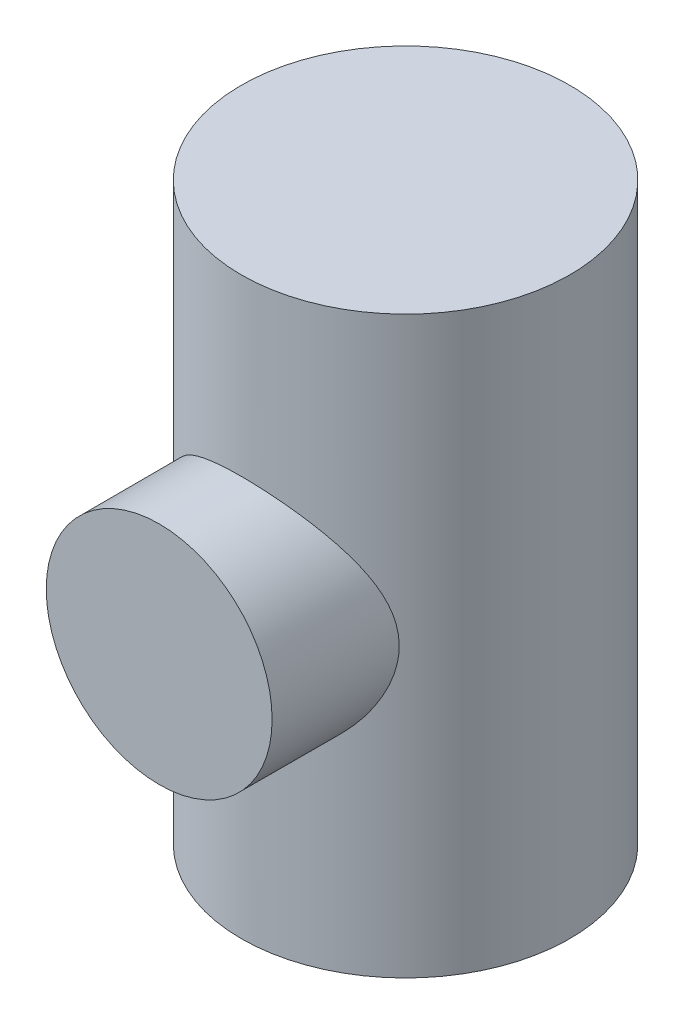
ISO-10303-21;
HEADER;
FILE_DESCRIPTION(('STEP AP214'),'2;1');
FILE_NAME('part.step','',(''),(''),'','','');
FILE_SCHEMA(('AUTOMOTIVE_DESIGN { 1 0 10303 214 1 1 1 1 }'));
ENDSEC;
DATA;
#1=APPLICATION_CONTEXT('core data for automotive mechanical design processes');
#2=APPLICATION_PROTOCOL_DEFINITION('international standard','automotive_design',2000,#1);
#3=PRODUCT_CONTEXT('',#1,'mechanical');
#4=PRODUCT('Part','Part','',(#3));
#5=PRODUCT_RELATED_PRODUCT_CATEGORY('part','',(#4));
#6=PRODUCT_DEFINITION_FORMATION('','',#4);
#7=PRODUCT_DEFINITION_CONTEXT('part definition',#1,'design');
#8=PRODUCT_DEFINITION('design','',#6,#7);
#9=PRODUCT_DEFINITION_SHAPE('','',#8);
#10=(LENGTH_UNIT() NAMED_UNIT(*) SI_UNIT(.MILLI.,.METRE.));
#11=(NAMED_UNIT(*) PLANE_ANGLE_UNIT() SI_UNIT($,.RADIAN.));
#12=(NAMED_UNIT(*) SI_UNIT($,.STERADIAN.) SOLID_ANGLE_UNIT());
#13=UNCERTAINTY_MEASURE_WITH_UNIT(LENGTH_MEASURE(1.E-05),#10,'distance_accuracy_value','');
#14=(GEOMETRIC_REPRESENTATION_CONTEXT(3) GLOBAL_UNCERTAINTY_ASSIGNED_CONTEXT((#13)) GLOBAL_UNIT_ASSIGNED_CONTEXT((#10,
#11,#12)) REPRESENTATION_CONTEXT('',''));
#15=CARTESIAN_POINT('',(0.,0.,0.));
#16=DIRECTION('',(0.,0.,1.));
#17=DIRECTION('',(1.,0.,0.));
#18=AXIS2_PLACEMENT_3D('',#15,#16,#17);
#19=CARTESIAN_POINT('',(0.,88.9,0.));
#20=DIRECTION('',(0.,-1.,0.));
#21=DIRECTION('',(0.,0.,-1.));
#22=AXIS2_PLACEMENT_3D('',#19,#20,#21);
#23=CYLINDRICAL_SURFACE('',#22,50.8);
#24=CARTESIAN_POINT('',(0.,88.9,0.));
#25=DIRECTION('',(0.,1.,0.));
#26=DIRECTION('',(0.,0.,1.));
#27=AXIS2_PLACEMENT_3D('',#24,#25,#26);
#28=CIRCLE('',#27,50.8);
#29=CARTESIAN_POINT('',(0.,88.9,50.8));
#30=VERTEX_POINT('',#29);
#31=EDGE_CURVE('E42',#30,#30,#28,.T.);
#32=ORIENTED_EDGE('',*,*,#31,.F.);
#33=EDGE_LOOP('',(#32));
#34=FACE_BOUND('',#33,.T.);
#35=CARTESIAN_POINT('',(0.,-88.9,0.));
#36=DIRECTION('',(0.,1.,0.));
#37=DIRECTION('',(0.,0.,1.));
#38=AXIS2_PLACEMENT_3D('',#35,#36,#37);
#39=CIRCLE('',#38,50.8);
#40=CARTESIAN_POINT('',(0.,-88.9,50.8));
#41=VERTEX_POINT('',#40);
#42=EDGE_CURVE('E46',#41,#41,#39,.T.);
#43=ORIENTED_EDGE('',*,*,#42,.T.);
#44=EDGE_LOOP('',(#43));
#45=FACE_BOUND('',#44,.T.);
#46=CARTESIAN_POINT('',(-34.925,0.,36.8901663726257));
#47=CARTESIAN_POINT('',(-34.9249914845288,-0.843645731352331,36.8901814735616));
#48=CARTESIAN_POINT('',(-34.8943613775967,-1.68741694630255,36.9192472565266));
#49=CARTESIAN_POINT('',(-34.7725461859095,-3.36673884233864,37.0339946630768));
#50=CARTESIAN_POINT('',(-34.6813479718474,-4.20228770120932,37.1196885618797));
#51=CARTESIAN_POINT('',(-34.4402049805243,-5.85919430438415,37.3435299889975));
#52=CARTESIAN_POINT('',(-34.2901538949403,-6.68052354412421,37.4817724238395));
#53=CARTESIAN_POINT('',(-33.9341723961664,-8.30159253245522,37.8043571230568));
#54=CARTESIAN_POINT('',(-33.7282411984882,-9.10133197777859,37.9887000346235));
#55=CARTESIAN_POINT('',(-33.2661981806663,-10.6665122789953,38.3939230305388));
#56=CARTESIAN_POINT('',(-33.0106542365401,-11.4322308708088,38.6143855983015));
#57=CARTESIAN_POINT('',(-32.450863810428,-12.9360303517467,39.0859982808274));
#58=CARTESIAN_POINT('',(-32.1466088030051,-13.6741063748994,39.3371537656572));
#59=CARTESIAN_POINT('',(-31.6557575718443,-14.7589371672977,39.7315632108823));
#60=CARTESIAN_POINT('',(-31.4863843597101,-15.1168546460022,39.8659877746421));
#61=CARTESIAN_POINT('',(-31.136447887631,-15.8250809971001,40.1398925175332));
#62=CARTESIAN_POINT('',(-30.9558875769675,-16.1753918422367,40.2793713602015));
#63=CARTESIAN_POINT('',(-30.3976983799822,-17.2149476316831,40.704281717814));
#64=CARTESIAN_POINT('',(-30.0035781882484,-17.8927784395359,40.9961733124769));
#65=CARTESIAN_POINT('',(-29.1036248806838,-19.3278911000392,41.6410208359239));
#66=CARTESIAN_POINT('',(-28.5901389257298,-20.0794524277431,41.9960128744349));
#67=CARTESIAN_POINT('',(-27.5078739995737,-21.538277518041,42.7127407810997));
#68=CARTESIAN_POINT('',(-26.9390909982723,-22.2455380457663,43.0744771392306));
#69=CARTESIAN_POINT('',(-25.7472923062065,-23.6147663047742,43.7972962674638));
#70=CARTESIAN_POINT('',(-25.1242173709284,-24.2766831134173,44.1583778733361));
#71=CARTESIAN_POINT('',(-23.8258762877271,-25.552132152644,44.8722254652959));
#72=CARTESIAN_POINT('',(-23.1506067212935,-26.1656612087247,45.2249909047345));
#73=CARTESIAN_POINT('',(-21.6383552410146,-27.4346400750145,45.9699874430229));
#74=CARTESIAN_POINT('',(-20.7926997439503,-28.0813399632176,46.3596205356045));
#75=CARTESIAN_POINT('',(-19.0363525940616,-29.3004436439954,47.1080561767333));
#76=CARTESIAN_POINT('',(-18.1256495884829,-29.8728344180272,47.4668533192823));
#77=CARTESIAN_POINT('',(-16.2447305784571,-30.9358777298753,48.1429629802574));
#78=CARTESIAN_POINT('',(-15.2746095540608,-31.4266562882585,48.4603392919954));
#79=CARTESIAN_POINT('',(-13.7791688332616,-32.0965538296489,48.8983108393477));
#80=CARTESIAN_POINT('',(-13.2739867535213,-32.3088052245657,49.0379506929057));
#81=CARTESIAN_POINT('',(-12.2510652803927,-32.7103782421536,49.3034531952045));
#82=CARTESIAN_POINT('',(-11.7333269806195,-32.8997018532293,49.429317038574));
#83=CARTESIAN_POINT('',(-10.4366640021437,-33.339133485046,49.7226711834187));
#84=CARTESIAN_POINT('',(-9.65091148354593,-33.5751808982284,49.8813939292304));
#85=CARTESIAN_POINT('',(-8.05887940763292,-33.9924578543145,50.1632126549853));
#86=CARTESIAN_POINT('',(-7.25260342523472,-34.1736968742308,50.2863147939891));
#87=CARTESIAN_POINT('',(-5.6249175720221,-34.478993921398,50.4942857879963));
#88=CARTESIAN_POINT('',(-4.8035175668412,-34.6030879404932,50.5791787076876));
#89=CARTESIAN_POINT('',(-3.15078667308704,-34.792528232709,50.7089698787006));
#90=CARTESIAN_POINT('',(-2.31945545323674,-34.8578725405307,50.753866792073));
#91=CARTESIAN_POINT('',(-0.651534823186878,-34.9289150265416,50.8026850345213));
#92=CARTESIAN_POINT('',(0.185061357119878,-34.9345056596418,50.8065324824553));
#93=CARTESIAN_POINT('',(1.85565873418636,-34.8856773930319,50.772970673983));
#94=CARTESIAN_POINT('',(2.68965994059846,-34.8312587168032,50.7355615712207));
#95=CARTESIAN_POINT('',(4.3490297418953,-34.6631968012901,50.6203304525249));
#96=CARTESIAN_POINT('',(5.17439622164246,-34.54953938223,50.54249876079));
#97=CARTESIAN_POINT('',(6.81045740898032,-34.2646000329617,50.3481513682188));
#98=CARTESIAN_POINT('',(7.62115208173619,-34.093317965956,50.2316355755487));
#99=CARTESIAN_POINT('',(9.20640778163735,-33.6994250395464,49.9651382962085));
#100=CARTESIAN_POINT('',(9.98136809394377,-33.4779240776441,49.8158824344709));
#101=CARTESIAN_POINT('',(11.5079607953348,-32.9843302016604,49.4855210998539));
#102=CARTESIAN_POINT('',(12.2595936583785,-32.7122383162544,49.3044162745698));
#103=CARTESIAN_POINT('',(13.7361040676781,-32.1202088055794,48.9136253459974));
#104=CARTESIAN_POINT('',(14.460979906964,-31.8002681343419,48.7039374232352));
#105=CARTESIAN_POINT('',(15.8811590426832,-31.1153666790649,48.2595330384554));
#106=CARTESIAN_POINT('',(16.5764605773614,-30.7504032180343,48.0248150883004));
#107=CARTESIAN_POINT('',(18.0118093019905,-29.9347005987139,47.5064268388663));
#108=CARTESIAN_POINT('',(18.7480821394774,-29.4789304726149,47.2202203382958));
#109=CARTESIAN_POINT('',(20.1790137298798,-28.5185152228663,46.62668268571));
#110=CARTESIAN_POINT('',(20.8736698324024,-28.0138669917221,46.3193501909407));
#111=CARTESIAN_POINT('',(22.2203055964245,-26.9582330453261,45.6886346929723));
#112=CARTESIAN_POINT('',(22.8722424151399,-26.4072020408622,45.3652361317398));
#113=CARTESIAN_POINT('',(24.1313258169888,-25.2618125951782,44.7082037573932));
#114=CARTESIAN_POINT('',(24.7384701643561,-24.6674519941495,44.3745694345478));
#115=CARTESIAN_POINT('',(26.0079518628684,-23.330930599084,43.6445999737335));
#116=CARTESIAN_POINT('',(26.6616434240038,-22.5809975725919,43.2474107559229));
#117=CARTESIAN_POINT('',(27.9036936679047,-21.0268742878215,42.4566380876803));
#118=CARTESIAN_POINT('',(28.4920392241437,-20.2226731802884,42.0630553762295));
#119=CARTESIAN_POINT('',(29.6006712221761,-18.5621111199666,41.2903908223469));
#120=CARTESIAN_POINT('',(30.1209750500881,-17.7057635739996,40.911305293161));
#121=CARTESIAN_POINT('',(30.8476534176125,-16.3838523810981,40.362786951746));
#122=CARTESIAN_POINT('',(31.0808974087602,-15.9370270623648,40.1833149553112));
#123=CARTESIAN_POINT('',(31.5290666525978,-15.0309386482855,39.832635955885));
#124=CARTESIAN_POINT('',(31.7439873924614,-14.5716725253891,39.6614309934545));
#125=CARTESIAN_POINT('',(32.263534048983,-13.3949511472192,39.2411463672361));
#126=CARTESIAN_POINT('',(32.5554806311321,-12.6694183604267,38.9987734581222));
#127=CARTESIAN_POINT('',(33.0924249101996,-11.1921615977915,38.5441984865414));
#128=CARTESIAN_POINT('',(33.3374345697353,-10.4404443533484,38.3319887400827));
#129=CARTESIAN_POINT('',(33.777504424466,-8.91433453387251,37.9447768155385));
#130=CARTESIAN_POINT('',(33.9726392900436,-8.13997781391408,37.7697190825343));
#131=CARTESIAN_POINT('',(34.3105825988925,-6.57138203049711,37.4629972616678));
#132=CARTESIAN_POINT('',(34.4533916043687,-5.77714318075613,37.3313327075775));
#133=CARTESIAN_POINT('',(34.6851814349556,-4.16671271140394,37.1160831220056));
#134=CARTESIAN_POINT('',(34.7736553753182,-3.35038640557041,37.0329511888437));
#135=CARTESIAN_POINT('',(34.8928150125601,-1.70979182265392,36.9207025659829));
#136=CARTESIAN_POINT('',(34.9235022038461,-0.885523751504793,36.8915844794476));
#137=CARTESIAN_POINT('',(34.9263905513057,0.7631223950212,36.8888497975017));
#138=CARTESIAN_POINT('',(34.8985972170703,1.58750045271924,36.9152279736546));
#139=CARTESIAN_POINT('',(34.785166655381,3.22867568298984,37.0221310038778));
#140=CARTESIAN_POINT('',(34.6995310981622,4.04547307376916,37.1026542944693));
#141=CARTESIAN_POINT('',(34.4863310688893,5.56436912506832,37.3008196200195));
#142=CARTESIAN_POINT('',(34.3652565875931,6.26816729923437,37.4126442362929));
#143=CARTESIAN_POINT('',(34.0818091680351,7.66099956140281,37.6710370110227));
#144=CARTESIAN_POINT('',(33.9194323588026,8.3500322589765,37.8176084259596));
#145=CARTESIAN_POINT('',(33.646337408857,9.37037041919323,38.060199114615));
#146=CARTESIAN_POINT('',(33.5503309610904,9.70844039555544,38.1448977194905));
#147=CARTESIAN_POINT('',(33.3487407811598,10.3797825235907,38.3212660395582));
#148=CARTESIAN_POINT('',(33.2431594668808,10.7130558620354,38.4129339938817));
#149=CARTESIAN_POINT('',(32.9123335277399,11.7055727161755,38.6975836956687));
#150=CARTESIAN_POINT('',(32.673032500777,12.357417809237,38.9001883389436));
#151=CARTESIAN_POINT('',(32.0402449388077,13.9354657551569,39.4246177993149));
#152=CARTESIAN_POINT('',(31.6265320709174,14.8496330226445,39.758348738781));
#153=CARTESIAN_POINT('',(30.7278009331759,16.629878664274,40.4569687242516));
#154=CARTESIAN_POINT('',(30.2427552306553,17.4959383602245,40.8218697346868));
#155=CARTESIAN_POINT('',(29.2042980244331,19.1792625476425,41.5711388299953));
#156=CARTESIAN_POINT('',(28.650777284119,19.9964459057268,41.9555374273504));
#157=CARTESIAN_POINT('',(27.4788554507536,21.5786287071585,42.73226765185));
#158=CARTESIAN_POINT('',(26.8604616239644,22.3436339790294,43.1245983865713));
#159=CARTESIAN_POINT('',(25.5505345630252,23.831145088715,43.9135979719272));
#160=CARTESIAN_POINT('',(24.8579933327231,24.5527800142559,44.3102363976799));
#161=CARTESIAN_POINT('',(23.4100412079154,25.9370144156452,45.0919830468468));
#162=CARTESIAN_POINT('',(22.654625671325,26.5996095250225,45.4770904160502));
#163=CARTESIAN_POINT('',(21.0841802042991,27.8608289837352,46.2261094291766));
#164=CARTESIAN_POINT('',(20.2692320187474,28.459538373767,46.5900489490846));
#165=CARTESIAN_POINT('',(18.5816582756494,29.5889829125796,47.2884274100382));
#166=CARTESIAN_POINT('',(17.7090445849494,30.1197319811195,47.6228723878282));
#167=CARTESIAN_POINT('',(16.0635877832546,31.023235185692,48.1998579918406));
#168=CARTESIAN_POINT('',(15.2991305995323,31.4074949861996,48.4483425793791));
#169=CARTESIAN_POINT('',(13.7362002647497,32.1218058256997,48.9144303970319));
#170=CARTESIAN_POINT('',(12.9377306228082,32.4518624399427,49.1320368029118));
#171=CARTESIAN_POINT('',(11.3109916673235,33.0540301773393,49.5318343340401));
#172=CARTESIAN_POINT('',(10.4827358491532,33.3261671652337,49.7140412641899));
#173=CARTESIAN_POINT('',(8.80094990511527,33.8092330624393,50.0391514853682));
#174=CARTESIAN_POINT('',(7.94741950258815,34.0201613014774,50.1820543459923));
#175=CARTESIAN_POINT('',(6.21641743072877,34.3787293615336,50.4258267727246));
#176=CARTESIAN_POINT('',(5.33884322639946,34.5260294896056,50.5264706519088));
#177=CARTESIAN_POINT('',(3.57097745640846,34.7533873338667,50.6821015907666));
#178=CARTESIAN_POINT('',(2.68068585593677,34.8334448659637,50.737088525444));
#179=CARTESIAN_POINT('',(0.895112689670299,34.9249679950039,50.7999670995288));
#180=CARTESIAN_POINT('',(-0.000167731775237005,34.9364487224561,50.8078691275587));
#181=CARTESIAN_POINT('',(-1.78809356295396,34.8906564842974,50.7763920626338));
#182=CARTESIAN_POINT('',(-2.68073913402009,34.8333878196139,50.7370159273769));
#183=CARTESIAN_POINT('',(-4.37817541014974,34.6590596059218,50.6174990147927));
#184=CARTESIAN_POINT('',(-5.18383008991767,34.5476589748181,50.5412189393279));
#185=CARTESIAN_POINT('',(-6.78114058265845,34.2699403498627,50.3517911099989));
#186=CARTESIAN_POINT('',(-7.57279736142298,34.1036261604972,50.238645910208));
#187=CARTESIAN_POINT('',(-9.13736628901293,33.7181471197946,49.977772060461));
#188=CARTESIAN_POINT('',(-9.91027619636804,33.4989759825639,49.8300392973178));
#189=CARTESIAN_POINT('',(-11.4330988192576,33.0102928673679,49.5028371482696));
#190=CARTESIAN_POINT('',(-12.1830103569704,32.7407783161473,49.3233661401197));
#191=CARTESIAN_POINT('',(-13.6891290073958,32.1410847346887,48.9273008064707));
#192=CARTESIAN_POINT('',(-14.4441309308433,31.808739641091,48.7094097753484));
#193=CARTESIAN_POINT('',(-15.9220464066916,31.095296587989,48.2465352404641));
#194=CARTESIAN_POINT('',(-16.6449593994175,30.7141977786028,48.001551264424));
#195=CARTESIAN_POINT('',(-18.0562710071865,29.9063194435207,47.4886817873227));
#196=CARTESIAN_POINT('',(-18.7446680249477,29.4795378066389,47.2207952279568));
#197=CARTESIAN_POINT('',(-20.0851842262553,28.5830583647128,46.6663848028952));
#198=CARTESIAN_POINT('',(-20.7372990836058,28.1133554594105,46.379858723467));
#199=CARTESIAN_POINT('',(-21.736921718799,27.3400183013485,45.9163318861592));
#200=CARTESIAN_POINT('',(-22.097056417771,27.0497490069515,45.7440219309702));
#201=CARTESIAN_POINT('',(-22.8043588396722,26.4561890550111,45.3955573300754));
#202=CARTESIAN_POINT('',(-23.1515291148827,26.1529009859902,45.2194034520498));
#203=CARTESIAN_POINT('',(-24.1734843966271,25.2239185514406,44.6863829734259));
#204=CARTESIAN_POINT('',(-24.828706538984,24.5791116308113,44.3249609535299));
#205=CARTESIAN_POINT('',(-26.0864341140947,23.240036802404,43.5966430764542));
#206=CARTESIAN_POINT('',(-26.6888245716733,22.5456667072651,43.2297372198826));
#207=CARTESIAN_POINT('',(-27.8377852812144,21.1106194145993,42.4989558644997));
#208=CARTESIAN_POINT('',(-28.3843528334251,20.3699399802133,42.1350805130331));
#209=CARTESIAN_POINT('',(-29.4933849753858,18.7351388144899,41.3678261677201));
#210=CARTESIAN_POINT('',(-30.0470399285644,17.834182194157,40.9661959404635));
#211=CARTESIAN_POINT('',(-31.0750417184372,15.9757813576546,40.1919899389319));
#212=CARTESIAN_POINT('',(-31.5493654402674,15.0183207873958,39.8194226495842));
#213=CARTESIAN_POINT('',(-32.4118697186318,13.0527126234123,39.1205570746653));
#214=CARTESIAN_POINT('',(-32.8003275308988,12.044741452909,38.7941111357413));
#215=CARTESIAN_POINT('',(-33.3145297856323,10.4972963798788,38.3514443702232));
#216=CARTESIAN_POINT('',(-33.4744941401013,9.97566237270501,38.2117431005439));
#217=CARTESIAN_POINT('',(-33.7707655767776,8.92136241029695,37.9501571227367));
#218=CARTESIAN_POINT('',(-33.9070767015312,8.38869835764825,37.8282693706838));
#219=CARTESIAN_POINT('',(-34.1775914018353,7.21612216628492,37.5841892665651));
#220=CARTESIAN_POINT('',(-34.3069441626459,6.57425481924934,37.465938063215));
#221=CARTESIAN_POINT('',(-34.5298912529963,5.27954583687416,37.2605638618091));
#222=CARTESIAN_POINT('',(-34.6234940169745,4.62670682805419,37.1734335217734));
#223=CARTESIAN_POINT('',(-34.7737201005729,3.31364411899094,37.0329453994261));
#224=CARTESIAN_POINT('',(-34.8303717417012,2.65342646990104,36.9795617526384));
#225=CARTESIAN_POINT('',(-34.906018436322,1.32883231192934,36.9081631070351));
#226=CARTESIAN_POINT('',(-34.925006706782,0.664455075530447,36.8901544791339));
#227=CARTESIAN_POINT('',(-34.925,0.,36.8901663726257));
#228=B_SPLINE_CURVE_WITH_KNOTS('',3,(#46,#47,#48,#49,#50,#51,#52,#53,#54,#55,#56,#57,#58,#59,
#60,#61,#62,#63,#64,#65,#66,#67,#68,#69,#70,#71,#72,#73,#74,#75,#76,#77,#78,#79,#80,#81,#82,#83,
#84,#85,#86,#87,#88,#89,#90,#91,#92,#93,#94,#95,#96,#97,#98,#99,#100,#101,#102,#103,#104,#105,
#106,#107,#108,#109,#110,#111,#112,#113,#114,#115,#116,#117,#118,#119,#120,#121,#122,#123,#124,
#125,#126,#127,#128,#129,#130,#131,#132,#133,#134,#135,#136,#137,#138,#139,#140,#141,#142,#143,
#144,#145,#146,#147,#148,#149,#150,#151,#152,#153,#154,#155,#156,#157,#158,#159,#160,#161,#162,
#163,#164,#165,#166,#167,#168,#169,#170,#171,#172,#173,#174,#175,#176,#177,#178,#179,#180,#181,
#182,#183,#184,#185,#186,#187,#188,#189,#190,#191,#192,#193,#194,#195,#196,#197,#198,#199,#200,
#201,#202,#203,#204,#205,#206,#207,#208,#209,#210,#211,#212,#213,#214,#215,#216,#217,#218,#219,
#220,#221,#222,#223,#224,#225,#226,#227),.UNSPECIFIED.,.T.,.F.,(4,2,2,2,2,2,2,2,2,2,2,2,2,2,2,2,
2,2,2,2,2,2,2,2,2,2,2,2,2,2,2,2,2,2,2,2,2,2,2,2,2,2,2,2,2,2,2,2,2,2,2,2,2,2,2,2,2,2,2,2,2,2,2,2,
2,2,2,2,2,2,2,2,2,2,2,2,2,2,2,2,2,2,2,2,2,2,2,2,2,2,4),(0.,2.5301216281033,5.06079188802998,
7.59605460999117,10.131352925778,12.6391815987962,15.1474496741658,16.4017362748348,
17.6556936004719,20.1637378702094,23.0920695067244,26.0206147229432,28.9523966389216,
31.8843707362163,35.2806999364483,38.6776233539675,42.0692517393557,43.7650141244392,
45.4606293396163,47.9647438711847,50.4684251641439,52.9705273903303,55.4727133138769,
57.9794019327186,60.4860812163981,62.9933607910948,65.5006463179694,67.9571484215589,
70.413600582064,72.8702091825525,75.3269639199695,78.0602866668365,80.7937833027688,
83.5299806567135,86.2663144926203,89.4764394320524,92.6872080507621,95.8971546395916,
97.501828813471,99.1068970670391,101.560926782791,104.01433021572,106.4640387144,108.9137208919,
111.385921839886,113.85805885411,116.329962972789,118.801795716539,120.968136340989,
123.134680075853,124.218993212984,125.303033293302,127.471416583983,130.639316631596,
133.808438168816,136.982682152345,140.156570976069,143.381008685433,146.605684670401,
149.826013163836,153.045681004927,155.715912126859,158.38586842095,161.05462989897,
163.723420600457,166.40628824944,169.089163243368,171.771446276735,174.453561516571,
176.90142385067,179.349116629103,181.79710063756,184.245209806632,186.802273199171,
189.359381172888,191.916607371847,194.474137837583,195.954622007913,197.434813164881,
200.39522502466,203.361927409202,206.328773203899,209.717889947516,213.107992469466,
216.486983248695,218.175879190802,219.864486200737,221.858851160335,223.852745301576,
225.845109403942,227.837832291081),.UNSPECIFIED.);
#229=CARTESIAN_POINT('',(-34.925,0.,36.8901663726257));
#230=VERTEX_POINT('',#229);
#231=EDGE_CURVE('E10',#230,#230,#228,.T.);
#232=ORIENTED_EDGE('',*,*,#231,.F.);
#233=EDGE_LOOP('',(#232));
#234=FACE_BOUND('',#233,.T.);
#235=ADVANCED_FACE('F31',(#34,#45,#234),#23,.T.);
#236=CARTESIAN_POINT('',(0.,88.9,0.));
#237=DIRECTION('',(0.,1.,0.));
#238=DIRECTION('',(0.,0.,1.));
#239=AXIS2_PLACEMENT_3D('',#236,#237,#238);
#240=PLANE('',#239);
#241=ORIENTED_EDGE('',*,*,#31,.T.);
#242=EDGE_LOOP('',(#241));
#243=FACE_BOUND('',#242,.T.);
#244=ADVANCED_FACE('F66',(#243),#240,.T.);
#245=CARTESIAN_POINT('',(0.,-88.9,0.));
#246=DIRECTION('',(0.,1.,0.));
#247=DIRECTION('',(0.,0.,1.));
#248=AXIS2_PLACEMENT_3D('',#245,#246,#247);
#249=PLANE('',#248);
#250=ORIENTED_EDGE('',*,*,#42,.F.);
#251=EDGE_LOOP('',(#250));
#252=FACE_BOUND('',#251,.T.);
#253=ADVANCED_FACE('F60',(#252),#249,.F.);
#254=CARTESIAN_POINT('',(0.,0.,76.2));
#255=DIRECTION('',(0.,0.,-1.));
#256=DIRECTION('',(-1.,0.,0.));
#257=AXIS2_PLACEMENT_3D('',#254,#255,#256);
#258=CYLINDRICAL_SURFACE('',#257,34.925);
#259=CARTESIAN_POINT('',(0.,0.,76.2));
#260=DIRECTION('',(0.,0.,1.));
#261=DIRECTION('',(1.,0.,0.));
#262=AXIS2_PLACEMENT_3D('',#259,#260,#261);
#263=CIRCLE('',#262,34.925);
#264=CARTESIAN_POINT('',(34.925,0.,76.2));
#265=VERTEX_POINT('',#264);
#266=EDGE_CURVE('E51',#265,#265,#263,.T.);
#267=ORIENTED_EDGE('',*,*,#266,.F.);
#268=EDGE_LOOP('',(#267));
#269=FACE_BOUND('',#268,.T.);
#270=ORIENTED_EDGE('',*,*,#231,.T.);
#271=EDGE_LOOP('',(#270));
#272=FACE_BOUND('',#271,.T.);
#273=ADVANCED_FACE('F58',(#269,#272),#258,.T.);
#274=CARTESIAN_POINT('',(0.,0.,76.2));
#275=DIRECTION('',(0.,0.,1.));
#276=DIRECTION('',(1.,0.,0.));
#277=AXIS2_PLACEMENT_3D('',#274,#275,#276);
#278=PLANE('',#277);
#279=ORIENTED_EDGE('',*,*,#266,.T.);
#280=EDGE_LOOP('',(#279));
#281=FACE_BOUND('',#280,.T.);
#282=ADVANCED_FACE('F56',(#281),#278,.T.);
#283=CLOSED_SHELL('',(#235,#244,#253,#273,#282));
#284=MANIFOLD_SOLID_BREP('B2',#283);
#285=ADVANCED_BREP_SHAPE_REPRESENTATION('',(#18,#284),#14);
#286=SHAPE_DEFINITION_REPRESENTATION(#9,#285);
ENDSEC;
END-ISO-10303-21;
